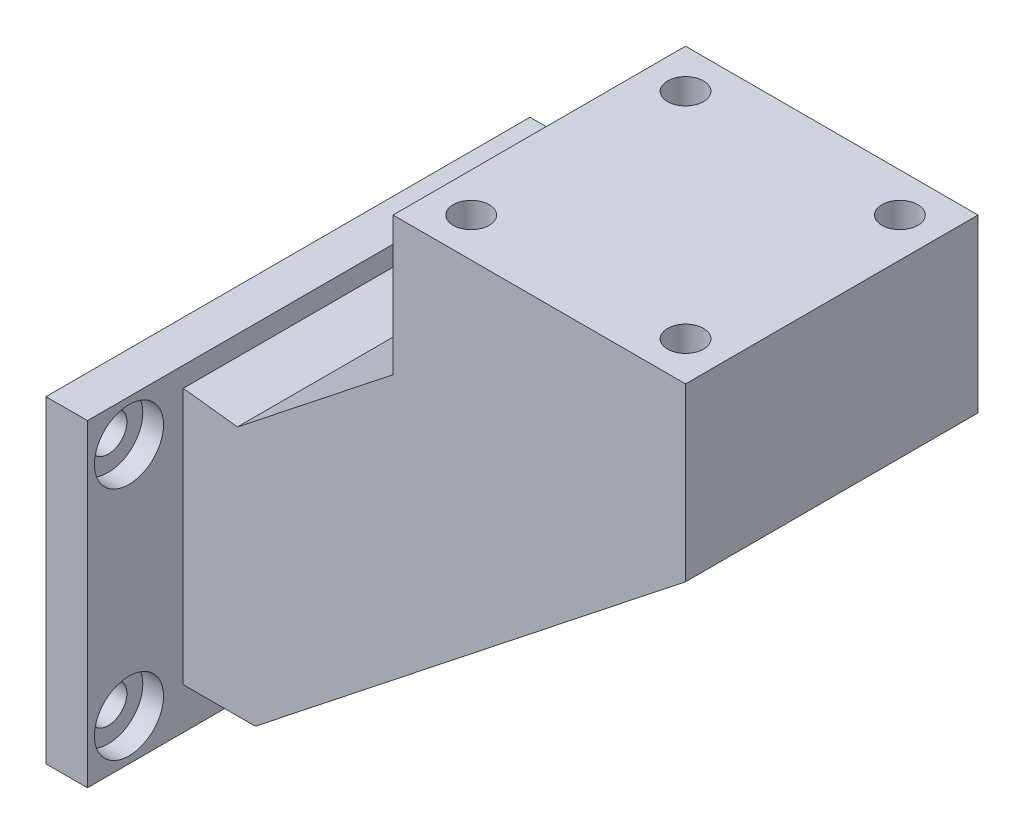
ISO-10303-21;
HEADER;
FILE_DESCRIPTION(('STEP AP214'),'2;1');
FILE_NAME('part.step','',(''),(''),'','','');
FILE_SCHEMA(('AUTOMOTIVE_DESIGN { 1 0 10303 214 1 1 1 1 }'));
ENDSEC;
DATA;
#1=APPLICATION_CONTEXT('core data for automotive mechanical design processes');
#2=APPLICATION_PROTOCOL_DEFINITION('international standard','automotive_design',2000,#1);
#3=PRODUCT_CONTEXT('',#1,'mechanical');
#4=PRODUCT('Part','Part','',(#3));
#5=PRODUCT_RELATED_PRODUCT_CATEGORY('part','',(#4));
#6=PRODUCT_DEFINITION_FORMATION('','',#4);
#7=PRODUCT_DEFINITION_CONTEXT('part definition',#1,'design');
#8=PRODUCT_DEFINITION('design','',#6,#7);
#9=PRODUCT_DEFINITION_SHAPE('','',#8);
#10=(LENGTH_UNIT() NAMED_UNIT(*) SI_UNIT(.MILLI.,.METRE.));
#11=(NAMED_UNIT(*) PLANE_ANGLE_UNIT() SI_UNIT($,.RADIAN.));
#12=(NAMED_UNIT(*) SI_UNIT($,.STERADIAN.) SOLID_ANGLE_UNIT());
#13=UNCERTAINTY_MEASURE_WITH_UNIT(LENGTH_MEASURE(1.E-05),#10,'distance_accuracy_value','');
#14=(GEOMETRIC_REPRESENTATION_CONTEXT(3) GLOBAL_UNCERTAINTY_ASSIGNED_CONTEXT((#13)) GLOBAL_UNIT_ASSIGNED_CONTEXT((#10,
#11,#12)) REPRESENTATION_CONTEXT('',''));
#15=CARTESIAN_POINT('',(0.,0.,0.));
#16=DIRECTION('',(0.,0.,1.));
#17=DIRECTION('',(1.,0.,0.));
#18=AXIS2_PLACEMENT_3D('',#15,#16,#17);
#19=CARTESIAN_POINT('',(16.4283340799578,6.,70.));
#20=DIRECTION('',(0.,1.,0.));
#21=DIRECTION('',(-1.,0.,0.));
#22=AXIS2_PLACEMENT_3D('',#19,#20,#21);
#23=PLANE('',#22);
#24=DIRECTION('',(0.,0.,-1.));
#25=VECTOR('',#24,1.);
#26=CARTESIAN_POINT('',(6.00000000000003,6.,70.));
#27=LINE('',#26,#25);
#28=CARTESIAN_POINT('',(6.00000000000003,6.,56.15));
#29=VERTEX_POINT('',#28);
#30=CARTESIAN_POINT('',(6.00000000000003,6.,13.85));
#31=VERTEX_POINT('',#30);
#32=EDGE_CURVE('E282',#29,#31,#27,.T.);
#33=ORIENTED_EDGE('',*,*,#32,.T.);
#34=DIRECTION('',(-1.,0.,0.));
#35=VECTOR('',#34,1.);
#36=CARTESIAN_POINT('',(16.4283340799578,6.,13.85));
#37=LINE('',#36,#35);
#38=CARTESIAN_POINT('',(16.4283340799578,6.,13.85));
#39=VERTEX_POINT('',#38);
#40=EDGE_CURVE('E222',#39,#31,#37,.T.);
#41=ORIENTED_EDGE('',*,*,#40,.F.);
#42=DIRECTION('',(0.,0.,-1.));
#43=VECTOR('',#42,1.);
#44=CARTESIAN_POINT('',(16.4283340799578,6.,70.));
#45=LINE('',#44,#43);
#46=CARTESIAN_POINT('',(16.4283340799578,5.99999999999999,56.15));
#47=VERTEX_POINT('',#46);
#48=EDGE_CURVE('E279',#47,#39,#45,.T.);
#49=ORIENTED_EDGE('',*,*,#48,.F.);
#50=DIRECTION('',(1.,0.,0.));
#51=VECTOR('',#50,1.);
#52=CARTESIAN_POINT('',(0.,6.,56.15));
#53=LINE('',#52,#51);
#54=EDGE_CURVE('E228',#29,#47,#53,.T.);
#55=ORIENTED_EDGE('',*,*,#54,.F.);
#56=EDGE_LOOP('',(#33,#41,#49,#55));
#57=FACE_BOUND('',#56,.T.);
#58=ADVANCED_FACE('F39',(#57),#23,.F.);
#59=CARTESIAN_POINT('',(78.65,55.2032943025046,70.));
#60=DIRECTION('',(-0.620272565762113,0.784386348786671,0.));
#61=DIRECTION('',(-0.784386348786671,-0.620272565762113,0.));
#62=AXIS2_PLACEMENT_3D('',#59,#60,#61);
#63=PLANE('',#62);
#64=ORIENTED_EDGE('',*,*,#48,.T.);
#65=DIRECTION('',(-0.784386348786671,-0.620272565762113,0.));
#66=VECTOR('',#65,1.);
#67=CARTESIAN_POINT('',(78.65,55.2032943025046,13.85));
#68=LINE('',#67,#66);
#69=CARTESIAN_POINT('',(78.65,55.2032943025046,13.85));
#70=VERTEX_POINT('',#69);
#71=EDGE_CURVE('E220',#70,#39,#68,.T.);
#72=ORIENTED_EDGE('',*,*,#71,.F.);
#73=DIRECTION('',(0.,0.,-1.));
#74=VECTOR('',#73,1.);
#75=CARTESIAN_POINT('',(78.65,55.2032943025046,70.));
#76=LINE('',#75,#74);
#77=CARTESIAN_POINT('',(78.65,55.2032943025046,56.15));
#78=VERTEX_POINT('',#77);
#79=EDGE_CURVE('E276',#78,#70,#76,.T.);
#80=ORIENTED_EDGE('',*,*,#79,.F.);
#81=DIRECTION('',(0.784386348786671,0.620272565762113,0.));
#82=VECTOR('',#81,1.);
#83=CARTESIAN_POINT('',(3.40140531590146,-4.30136047240039,56.15));
#84=LINE('',#83,#82);
#85=EDGE_CURVE('E230',#47,#78,#84,.T.);
#86=ORIENTED_EDGE('',*,*,#85,.F.);
#87=EDGE_LOOP('',(#64,#72,#80,#86));
#88=FACE_BOUND('',#87,.T.);
#89=ADVANCED_FACE('F330',(#88),#63,.F.);
#90=CARTESIAN_POINT('',(78.65,80.,70.));
#91=DIRECTION('',(-1.,0.,0.));
#92=DIRECTION('',(0.,-1.,0.));
#93=AXIS2_PLACEMENT_3D('',#90,#91,#92);
#94=PLANE('',#93);
#95=ORIENTED_EDGE('',*,*,#79,.T.);
#96=DIRECTION('',(0.,-1.,0.));
#97=VECTOR('',#96,1.);
#98=CARTESIAN_POINT('',(78.65,80.,13.85));
#99=LINE('',#98,#97);
#100=CARTESIAN_POINT('',(78.65,80.,13.85));
#101=VERTEX_POINT('',#100);
#102=EDGE_CURVE('E218',#101,#70,#99,.T.);
#103=ORIENTED_EDGE('',*,*,#102,.F.);
#104=DIRECTION('',(0.,0.,-1.));
#105=VECTOR('',#104,1.);
#106=CARTESIAN_POINT('',(78.65,80.,70.));
#107=LINE('',#106,#105);
#108=CARTESIAN_POINT('',(78.65,80.,56.15));
#109=VERTEX_POINT('',#108);
#110=EDGE_CURVE('E273',#109,#101,#107,.T.);
#111=ORIENTED_EDGE('',*,*,#110,.F.);
#112=DIRECTION('',(0.,1.,0.));
#113=VECTOR('',#112,1.);
#114=CARTESIAN_POINT('',(78.65,0.,56.15));
#115=LINE('',#114,#113);
#116=EDGE_CURVE('E232',#78,#109,#115,.T.);
#117=ORIENTED_EDGE('',*,*,#116,.F.);
#118=EDGE_LOOP('',(#95,#103,#111,#117));
#119=FACE_BOUND('',#118,.T.);
#120=ADVANCED_FACE('F325',(#119),#94,.F.);
#121=CARTESIAN_POINT('',(36.35,80.,70.));
#122=DIRECTION('',(0.,-1.,0.));
#123=DIRECTION('',(0.,0.,-1.));
#124=AXIS2_PLACEMENT_3D('',#121,#122,#123);
#125=PLANE('',#124);
#126=CARTESIAN_POINT('',(42.,80.,19.5));
#127=DIRECTION('',(0.,1.,0.));
#128=DIRECTION('',(0.,0.,1.));
#129=AXIS2_PLACEMENT_3D('',#126,#127,#128);
#130=CIRCLE('',#129,2.6);
#131=CARTESIAN_POINT('',(42.,80.,22.1));
#132=VERTEX_POINT('',#131);
#133=EDGE_CURVE('E150',#132,#132,#130,.T.);
#134=ORIENTED_EDGE('',*,*,#133,.F.);
#135=EDGE_LOOP('',(#134));
#136=FACE_BOUND('',#135,.T.);
#137=CARTESIAN_POINT('',(73.,80.,50.5));
#138=DIRECTION('',(0.,1.,0.));
#139=DIRECTION('',(0.,0.,1.));
#140=AXIS2_PLACEMENT_3D('',#137,#138,#139);
#141=CIRCLE('',#140,2.59999999999999);
#142=CARTESIAN_POINT('',(73.,80.,53.1));
#143=VERTEX_POINT('',#142);
#144=EDGE_CURVE('E149',#143,#143,#141,.T.);
#145=ORIENTED_EDGE('',*,*,#144,.F.);
#146=EDGE_LOOP('',(#145));
#147=FACE_BOUND('',#146,.T.);
#148=CARTESIAN_POINT('',(42.,80.,50.5));
#149=DIRECTION('',(0.,1.,0.));
#150=DIRECTION('',(0.,0.,1.));
#151=AXIS2_PLACEMENT_3D('',#148,#149,#150);
#152=CIRCLE('',#151,2.6);
#153=CARTESIAN_POINT('',(42.,80.,53.1));
#154=VERTEX_POINT('',#153);
#155=EDGE_CURVE('E160',#154,#154,#152,.T.);
#156=ORIENTED_EDGE('',*,*,#155,.F.);
#157=EDGE_LOOP('',(#156));
#158=FACE_BOUND('',#157,.T.);
#159=CARTESIAN_POINT('',(73.,80.,19.5));
#160=DIRECTION('',(0.,1.,0.));
#161=DIRECTION('',(0.,0.,1.));
#162=AXIS2_PLACEMENT_3D('',#159,#160,#161);
#163=CIRCLE('',#162,2.59999999999999);
#164=CARTESIAN_POINT('',(73.,80.,22.1));
#165=VERTEX_POINT('',#164);
#166=EDGE_CURVE('E166',#165,#165,#163,.T.);
#167=ORIENTED_EDGE('',*,*,#166,.F.);
#168=EDGE_LOOP('',(#167));
#169=FACE_BOUND('',#168,.T.);
#170=ORIENTED_EDGE('',*,*,#110,.T.);
#171=DIRECTION('',(1.,0.,0.));
#172=VECTOR('',#171,1.);
#173=CARTESIAN_POINT('',(36.35,80.,13.85));
#174=LINE('',#173,#172);
#175=CARTESIAN_POINT('',(36.35,80.,13.85));
#176=VERTEX_POINT('',#175);
#177=EDGE_CURVE('E216',#176,#101,#174,.T.);
#178=ORIENTED_EDGE('',*,*,#177,.F.);
#179=DIRECTION('',(0.,0.,-1.));
#180=VECTOR('',#179,1.);
#181=CARTESIAN_POINT('',(36.35,80.,70.));
#182=LINE('',#181,#180);
#183=CARTESIAN_POINT('',(36.35,80.,56.15));
#184=VERTEX_POINT('',#183);
#185=EDGE_CURVE('E270',#184,#176,#182,.T.);
#186=ORIENTED_EDGE('',*,*,#185,.F.);
#187=DIRECTION('',(-1.,0.,0.));
#188=VECTOR('',#187,1.);
#189=CARTESIAN_POINT('',(0.,80.,56.15));
#190=LINE('',#189,#188);
#191=EDGE_CURVE('E234',#109,#184,#190,.T.);
#192=ORIENTED_EDGE('',*,*,#191,.F.);
#193=EDGE_LOOP('',(#170,#178,#186,#192));
#194=FACE_BOUND('',#193,.T.);
#195=ADVANCED_FACE('F320',(#136,#147,#158,#169,#194),#125,.F.);
#196=CARTESIAN_POINT('',(36.35,60.,70.));
#197=DIRECTION('',(1.,0.,0.));
#198=DIRECTION('',(0.,0.,-1.));
#199=AXIS2_PLACEMENT_3D('',#196,#197,#198);
#200=PLANE('',#199);
#201=ORIENTED_EDGE('',*,*,#185,.T.);
#202=DIRECTION('',(0.,1.,0.));
#203=VECTOR('',#202,1.);
#204=CARTESIAN_POINT('',(36.35,60.,13.85));
#205=LINE('',#204,#203);
#206=CARTESIAN_POINT('',(36.35,60.,13.85));
#207=VERTEX_POINT('',#206);
#208=EDGE_CURVE('E214',#207,#176,#205,.T.);
#209=ORIENTED_EDGE('',*,*,#208,.F.);
#210=DIRECTION('',(0.,0.,-1.));
#211=VECTOR('',#210,1.);
#212=CARTESIAN_POINT('',(36.35,60.,70.));
#213=LINE('',#212,#211);
#214=CARTESIAN_POINT('',(36.35,60.,56.15));
#215=VERTEX_POINT('',#214);
#216=EDGE_CURVE('E267',#215,#207,#213,.T.);
#217=ORIENTED_EDGE('',*,*,#216,.F.);
#218=DIRECTION('',(0.,-1.,0.));
#219=VECTOR('',#218,1.);
#220=CARTESIAN_POINT('',(36.35,0.,56.15));
#221=LINE('',#220,#219);
#222=EDGE_CURVE('E236',#184,#215,#221,.T.);
#223=ORIENTED_EDGE('',*,*,#222,.F.);
#224=EDGE_LOOP('',(#201,#209,#217,#223));
#225=FACE_BOUND('',#224,.T.);
#226=ADVANCED_FACE('F314',(#225),#200,.F.);
#227=CARTESIAN_POINT('',(6.00000000000002,36.,70.));
#228=DIRECTION('',(0.620272565762113,-0.784386348786671,0.));
#229=DIRECTION('',(0.784386348786671,0.620272565762113,0.));
#230=AXIS2_PLACEMENT_3D('',#227,#228,#229);
#231=PLANE('',#230);
#232=DIRECTION('',(0.784386348786671,0.620272565762113,0.));
#233=VECTOR('',#232,1.);
#234=CARTESIAN_POINT('',(6.00000000000002,36.,13.85));
#235=LINE('',#234,#233);
#236=CARTESIAN_POINT('',(13.8438634878667,42.2027256576211,13.85));
#237=VERTEX_POINT('',#236);
#238=EDGE_CURVE('E212',#237,#207,#235,.T.);
#239=ORIENTED_EDGE('',*,*,#238,.F.);
#240=DIRECTION('',(0.,0.,1.));
#241=VECTOR('',#240,1.);
#242=CARTESIAN_POINT('',(13.8438634878667,42.2027256576211,56.15));
#243=LINE('',#242,#241);
#244=CARTESIAN_POINT('',(13.8438634878667,42.2027256576211,56.15));
#245=VERTEX_POINT('',#244);
#246=EDGE_CURVE('E55',#237,#245,#243,.T.);
#247=ORIENTED_EDGE('',*,*,#246,.T.);
#248=DIRECTION('',(-0.784386348786671,-0.620272565762113,0.));
#249=VECTOR('',#248,1.);
#250=CARTESIAN_POINT('',(-15.2067716569619,19.2302299911998,56.15));
#251=LINE('',#250,#249);
#252=EDGE_CURVE('E238',#215,#245,#251,.T.);
#253=ORIENTED_EDGE('',*,*,#252,.F.);
#254=ORIENTED_EDGE('',*,*,#216,.T.);
#255=EDGE_LOOP('',(#239,#247,#253,#254));
#256=FACE_BOUND('',#255,.T.);
#257=ADVANCED_FACE('F311',(#256),#231,.F.);
#258=CARTESIAN_POINT('',(6.00000000000003,0.,70.));
#259=DIRECTION('',(0.,1.,0.));
#260=DIRECTION('',(-1.,0.,0.));
#261=AXIS2_PLACEMENT_3D('',#258,#259,#260);
#262=PLANE('',#261);
#263=DIRECTION('',(1.,0.,0.));
#264=VECTOR('',#263,1.);
#265=CARTESIAN_POINT('',(6.00000000000003,0.,0.));
#266=LINE('',#265,#264);
#267=CARTESIAN_POINT('',(0.,0.,0.));
#268=VERTEX_POINT('',#267);
#269=CARTESIAN_POINT('',(6.00000000000003,0.,0.));
#270=VERTEX_POINT('',#269);
#271=EDGE_CURVE('E240',#268,#270,#266,.T.);
#272=ORIENTED_EDGE('',*,*,#271,.T.);
#273=DIRECTION('',(0.,0.,-1.));
#274=VECTOR('',#273,1.);
#275=CARTESIAN_POINT('',(6.00000000000003,0.,70.));
#276=LINE('',#275,#274);
#277=CARTESIAN_POINT('',(6.00000000000003,0.,70.));
#278=VERTEX_POINT('',#277);
#279=EDGE_CURVE('E285',#278,#270,#276,.T.);
#280=ORIENTED_EDGE('',*,*,#279,.F.);
#281=DIRECTION('',(1.,0.,0.));
#282=VECTOR('',#281,1.);
#283=CARTESIAN_POINT('',(6.00000000000003,0.,70.));
#284=LINE('',#283,#282);
#285=CARTESIAN_POINT('',(0.,0.,70.));
#286=VERTEX_POINT('',#285);
#287=EDGE_CURVE('E241',#286,#278,#284,.T.);
#288=ORIENTED_EDGE('',*,*,#287,.F.);
#289=DIRECTION('',(0.,0.,-1.));
#290=VECTOR('',#289,1.);
#291=CARTESIAN_POINT('',(0.,0.,70.));
#292=LINE('',#291,#290);
#293=EDGE_CURVE('E251',#286,#268,#292,.T.);
#294=ORIENTED_EDGE('',*,*,#293,.T.);
#295=EDGE_LOOP('',(#272,#280,#288,#294));
#296=FACE_BOUND('',#295,.T.);
#297=ADVANCED_FACE('F341',(#296),#262,.F.);
#298=CARTESIAN_POINT('',(6.,46.,70.));
#299=DIRECTION('',(-1.,0.,0.));
#300=DIRECTION('',(0.,-1.,0.));
#301=AXIS2_PLACEMENT_3D('',#298,#299,#300);
#302=PLANE('',#301);
#303=CARTESIAN_POINT('',(6.00000000000011,6.00000000000001,64.));
#304=DIRECTION('',(1.,0.,0.));
#305=DIRECTION('',(0.,0.,-1.));
#306=AXIS2_PLACEMENT_3D('',#303,#304,#305);
#307=CIRCLE('',#306,4.99999999999999);
#308=CARTESIAN_POINT('',(6.00000000000011,6.00000000000001,59.));
#309=VERTEX_POINT('',#308);
#310=EDGE_CURVE('E172',#309,#309,#307,.T.);
#311=ORIENTED_EDGE('',*,*,#310,.F.);
#312=EDGE_LOOP('',(#311));
#313=FACE_BOUND('',#312,.T.);
#314=CARTESIAN_POINT('',(6.00000000000011,6.00000000000001,6.));
#315=DIRECTION('',(1.,0.,0.));
#316=DIRECTION('',(0.,0.,-1.));
#317=AXIS2_PLACEMENT_3D('',#314,#315,#316);
#318=CIRCLE('',#317,4.99999999999999);
#319=CARTESIAN_POINT('',(6.00000000000011,6.00000000000001,1.));
#320=VERTEX_POINT('',#319);
#321=EDGE_CURVE('E182',#320,#320,#318,.T.);
#322=ORIENTED_EDGE('',*,*,#321,.F.);
#323=EDGE_LOOP('',(#322));
#324=FACE_BOUND('',#323,.T.);
#325=CARTESIAN_POINT('',(6.00000000000009,40.,6.));
#326=DIRECTION('',(1.,0.,0.));
#327=DIRECTION('',(0.,0.,-1.));
#328=AXIS2_PLACEMENT_3D('',#325,#326,#327);
#329=CIRCLE('',#328,4.99999999999999);
#330=CARTESIAN_POINT('',(6.00000000000009,40.,1.00000000000001));
#331=VERTEX_POINT('',#330);
#332=EDGE_CURVE('E192',#331,#331,#329,.T.);
#333=ORIENTED_EDGE('',*,*,#332,.F.);
#334=EDGE_LOOP('',(#333));
#335=FACE_BOUND('',#334,.T.);
#336=CARTESIAN_POINT('',(6.00000000000009,40.,64.));
#337=DIRECTION('',(1.,0.,0.));
#338=DIRECTION('',(0.,0.,-1.));
#339=AXIS2_PLACEMENT_3D('',#336,#337,#338);
#340=CIRCLE('',#339,4.99999999999999);
#341=CARTESIAN_POINT('',(6.00000000000009,40.,59.));
#342=VERTEX_POINT('',#341);
#343=EDGE_CURVE('E202',#342,#342,#340,.T.);
#344=ORIENTED_EDGE('',*,*,#343,.F.);
#345=EDGE_LOOP('',(#344));
#346=FACE_BOUND('',#345,.T.);
#347=ORIENTED_EDGE('',*,*,#279,.T.);
#348=DIRECTION('',(0.,1.,0.));
#349=VECTOR('',#348,1.);
#350=CARTESIAN_POINT('',(6.,46.,0.));
#351=LINE('',#350,#349);
#352=CARTESIAN_POINT('',(6.,46.,0.));
#353=VERTEX_POINT('',#352);
#354=EDGE_CURVE('E254',#270,#353,#351,.T.);
#355=ORIENTED_EDGE('',*,*,#354,.T.);
#356=DIRECTION('',(0.,0.,-1.));
#357=VECTOR('',#356,1.);
#358=CARTESIAN_POINT('',(6.,46.,70.));
#359=LINE('',#358,#357);
#360=CARTESIAN_POINT('',(6.,46.,70.));
#361=VERTEX_POINT('',#360);
#362=EDGE_CURVE('E264',#361,#353,#359,.T.);
#363=ORIENTED_EDGE('',*,*,#362,.F.);
#364=DIRECTION('',(0.,1.,0.));
#365=VECTOR('',#364,1.);
#366=CARTESIAN_POINT('',(6.00000000000003,6.,70.));
#367=LINE('',#366,#365);
#368=EDGE_CURVE('E244',#278,#361,#367,.T.);
#369=ORIENTED_EDGE('',*,*,#368,.F.);
#370=EDGE_LOOP('',(#347,#355,#363,#369));
#371=FACE_BOUND('',#370,.T.);
#372=DIRECTION('',(0.,0.,-1.));
#373=VECTOR('',#372,1.);
#374=CARTESIAN_POINT('',(6.00000000000001,43.1191660099294,13.85));
#375=LINE('',#374,#373);
#376=CARTESIAN_POINT('',(6.00000000000002,43.1191660099294,56.15));
#377=VERTEX_POINT('',#376);
#378=CARTESIAN_POINT('',(6.00000000000001,43.1191660099294,13.85));
#379=VERTEX_POINT('',#378);
#380=EDGE_CURVE('E288',#377,#379,#375,.T.);
#381=ORIENTED_EDGE('',*,*,#380,.T.);
#382=DIRECTION('',(0.,1.,0.));
#383=VECTOR('',#382,1.);
#384=CARTESIAN_POINT('',(6.00000000000003,6.,13.85));
#385=LINE('',#384,#383);
#386=EDGE_CURVE('E224',#31,#379,#385,.T.);
#387=ORIENTED_EDGE('',*,*,#386,.F.);
#388=ORIENTED_EDGE('',*,*,#32,.F.);
#389=DIRECTION('',(0.,1.,0.));
#390=VECTOR('',#389,1.);
#391=CARTESIAN_POINT('',(6.00000000000003,0.,56.15));
#392=LINE('',#391,#390);
#393=EDGE_CURVE('E226',#29,#377,#392,.T.);
#394=ORIENTED_EDGE('',*,*,#393,.T.);
#395=EDGE_LOOP('',(#381,#387,#388,#394));
#396=FACE_BOUND('',#395,.T.);
#397=ADVANCED_FACE('F302',(#313,#324,#335,#346,#371,#396),#302,.F.);
#398=CARTESIAN_POINT('',(0.,46.,70.));
#399=DIRECTION('',(0.,-1.,0.));
#400=DIRECTION('',(0.,0.,-1.));
#401=AXIS2_PLACEMENT_3D('',#398,#399,#400);
#402=PLANE('',#401);
#403=DIRECTION('',(-1.,0.,0.));
#404=VECTOR('',#403,1.);
#405=CARTESIAN_POINT('',(0.,46.,0.));
#406=LINE('',#405,#404);
#407=CARTESIAN_POINT('',(0.,46.,0.));
#408=VERTEX_POINT('',#407);
#409=EDGE_CURVE('E256',#353,#408,#406,.T.);
#410=ORIENTED_EDGE('',*,*,#409,.T.);
#411=DIRECTION('',(0.,0.,-1.));
#412=VECTOR('',#411,1.);
#413=CARTESIAN_POINT('',(0.,46.,70.));
#414=LINE('',#413,#412);
#415=CARTESIAN_POINT('',(0.,46.,70.));
#416=VERTEX_POINT('',#415);
#417=EDGE_CURVE('E261',#416,#408,#414,.T.);
#418=ORIENTED_EDGE('',*,*,#417,.F.);
#419=DIRECTION('',(-1.,0.,0.));
#420=VECTOR('',#419,1.);
#421=CARTESIAN_POINT('',(0.,46.,70.));
#422=LINE('',#421,#420);
#423=EDGE_CURVE('E247',#361,#416,#422,.T.);
#424=ORIENTED_EDGE('',*,*,#423,.F.);
#425=ORIENTED_EDGE('',*,*,#362,.T.);
#426=EDGE_LOOP('',(#410,#418,#424,#425));
#427=FACE_BOUND('',#426,.T.);
#428=ADVANCED_FACE('F348',(#427),#402,.F.);
#429=CARTESIAN_POINT('',(0.,0.,70.));
#430=DIRECTION('',(1.,0.,0.));
#431=DIRECTION('',(0.,0.,-1.));
#432=AXIS2_PLACEMENT_3D('',#429,#430,#431);
#433=PLANE('',#432);
#434=CARTESIAN_POINT('',(0.,6.00000000000001,64.));
#435=DIRECTION('',(1.,0.,0.));
#436=DIRECTION('',(0.,0.,-1.));
#437=AXIS2_PLACEMENT_3D('',#434,#435,#436);
#438=CIRCLE('',#437,2.69999999999999);
#439=CARTESIAN_POINT('',(0.,6.00000000000001,61.3));
#440=VERTEX_POINT('',#439);
#441=EDGE_CURVE('E181',#440,#440,#438,.T.);
#442=ORIENTED_EDGE('',*,*,#441,.T.);
#443=EDGE_LOOP('',(#442));
#444=FACE_BOUND('',#443,.T.);
#445=CARTESIAN_POINT('',(0.,6.00000000000001,6.));
#446=DIRECTION('',(1.,0.,0.));
#447=DIRECTION('',(0.,0.,-1.));
#448=AXIS2_PLACEMENT_3D('',#445,#446,#447);
#449=CIRCLE('',#448,2.69999999999999);
#450=CARTESIAN_POINT('',(0.,6.00000000000001,3.3));
#451=VERTEX_POINT('',#450);
#452=EDGE_CURVE('E191',#451,#451,#449,.T.);
#453=ORIENTED_EDGE('',*,*,#452,.T.);
#454=EDGE_LOOP('',(#453));
#455=FACE_BOUND('',#454,.T.);
#456=CARTESIAN_POINT('',(0.,40.,6.));
#457=DIRECTION('',(1.,0.,0.));
#458=DIRECTION('',(0.,0.,-1.));
#459=AXIS2_PLACEMENT_3D('',#456,#457,#458);
#460=CIRCLE('',#459,2.69999999999999);
#461=CARTESIAN_POINT('',(0.,40.,3.3));
#462=VERTEX_POINT('',#461);
#463=EDGE_CURVE('E201',#462,#462,#460,.T.);
#464=ORIENTED_EDGE('',*,*,#463,.T.);
#465=EDGE_LOOP('',(#464));
#466=FACE_BOUND('',#465,.T.);
#467=CARTESIAN_POINT('',(0.,40.,64.));
#468=DIRECTION('',(1.,0.,0.));
#469=DIRECTION('',(0.,0.,-1.));
#470=AXIS2_PLACEMENT_3D('',#467,#468,#469);
#471=CIRCLE('',#470,2.69999999999999);
#472=CARTESIAN_POINT('',(0.,40.,61.3));
#473=VERTEX_POINT('',#472);
#474=EDGE_CURVE('E211',#473,#473,#471,.T.);
#475=ORIENTED_EDGE('',*,*,#474,.T.);
#476=EDGE_LOOP('',(#475));
#477=FACE_BOUND('',#476,.T.);
#478=DIRECTION('',(0.,-1.,0.));
#479=VECTOR('',#478,1.);
#480=CARTESIAN_POINT('',(0.,0.,0.));
#481=LINE('',#480,#479);
#482=EDGE_CURVE('E245',#408,#268,#481,.T.);
#483=ORIENTED_EDGE('',*,*,#482,.T.);
#484=ORIENTED_EDGE('',*,*,#293,.F.);
#485=DIRECTION('',(0.,-1.,0.));
#486=VECTOR('',#485,1.);
#487=CARTESIAN_POINT('',(0.,0.,70.));
#488=LINE('',#487,#486);
#489=EDGE_CURVE('E249',#416,#286,#488,.T.);
#490=ORIENTED_EDGE('',*,*,#489,.F.);
#491=ORIENTED_EDGE('',*,*,#417,.T.);
#492=EDGE_LOOP('',(#483,#484,#490,#491));
#493=FACE_BOUND('',#492,.T.);
#494=ADVANCED_FACE('F368',(#444,#455,#466,#477,#493),#433,.F.);
#495=CARTESIAN_POINT('',(0.,0.,70.));
#496=DIRECTION('',(0.,0.,-1.));
#497=DIRECTION('',(-1.,0.,0.));
#498=AXIS2_PLACEMENT_3D('',#495,#496,#497);
#499=PLANE('',#498);
#500=ORIENTED_EDGE('',*,*,#368,.T.);
#501=ORIENTED_EDGE('',*,*,#423,.T.);
#502=ORIENTED_EDGE('',*,*,#489,.T.);
#503=ORIENTED_EDGE('',*,*,#287,.T.);
#504=EDGE_LOOP('',(#500,#501,#502,#503));
#505=FACE_BOUND('',#504,.T.);
#506=ADVANCED_FACE('F364',(#505),#499,.F.);
#507=CARTESIAN_POINT('',(0.,0.,0.));
#508=DIRECTION('',(0.,0.,-1.));
#509=DIRECTION('',(-1.,0.,0.));
#510=AXIS2_PLACEMENT_3D('',#507,#508,#509);
#511=PLANE('',#510);
#512=ORIENTED_EDGE('',*,*,#354,.F.);
#513=ORIENTED_EDGE('',*,*,#271,.F.);
#514=ORIENTED_EDGE('',*,*,#482,.F.);
#515=ORIENTED_EDGE('',*,*,#409,.F.);
#516=EDGE_LOOP('',(#512,#513,#514,#515));
#517=FACE_BOUND('',#516,.T.);
#518=ADVANCED_FACE('F358',(#517),#511,.T.);
#519=CARTESIAN_POINT('',(0.,0.,56.15));
#520=DIRECTION('',(0.,0.,1.));
#521=DIRECTION('',(1.,0.,0.));
#522=AXIS2_PLACEMENT_3D('',#519,#520,#521);
#523=PLANE('',#522);
#524=ORIENTED_EDGE('',*,*,#393,.F.);
#525=ORIENTED_EDGE('',*,*,#54,.T.);
#526=ORIENTED_EDGE('',*,*,#85,.T.);
#527=ORIENTED_EDGE('',*,*,#116,.T.);
#528=ORIENTED_EDGE('',*,*,#191,.T.);
#529=ORIENTED_EDGE('',*,*,#222,.T.);
#530=ORIENTED_EDGE('',*,*,#252,.T.);
#531=DIRECTION('',(0.99324384373158,-0.116045968862847,0.));
#532=VECTOR('',#531,1.);
#533=CARTESIAN_POINT('',(6.00000000000001,43.1191660099294,56.15));
#534=LINE('',#533,#532);
#535=EDGE_CURVE('E11',#245,#377,#534,.F.);
#536=ORIENTED_EDGE('',*,*,#535,.T.);
#537=EDGE_LOOP('',(#524,#525,#526,#527,#528,#529,#530,#536));
#538=FACE_BOUND('',#537,.T.);
#539=ADVANCED_FACE('F307',(#538),#523,.T.);
#540=CARTESIAN_POINT('',(0.,0.,13.85));
#541=DIRECTION('',(0.,0.,1.));
#542=DIRECTION('',(1.,0.,0.));
#543=AXIS2_PLACEMENT_3D('',#540,#541,#542);
#544=PLANE('',#543);
#545=ORIENTED_EDGE('',*,*,#386,.T.);
#546=DIRECTION('',(-0.99324384373158,0.116045968862847,0.));
#547=VECTOR('',#546,1.);
#548=CARTESIAN_POINT('',(5.05079890632275,43.2300662297059,13.85));
#549=LINE('',#548,#547);
#550=EDGE_CURVE('E48',#379,#237,#549,.F.);
#551=ORIENTED_EDGE('',*,*,#550,.T.);
#552=ORIENTED_EDGE('',*,*,#238,.T.);
#553=ORIENTED_EDGE('',*,*,#208,.T.);
#554=ORIENTED_EDGE('',*,*,#177,.T.);
#555=ORIENTED_EDGE('',*,*,#102,.T.);
#556=ORIENTED_EDGE('',*,*,#71,.T.);
#557=ORIENTED_EDGE('',*,*,#40,.T.);
#558=EDGE_LOOP('',(#545,#551,#552,#553,#554,#555,#556,#557));
#559=FACE_BOUND('',#558,.T.);
#560=ADVANCED_FACE('F317',(#559),#544,.F.);
#561=CARTESIAN_POINT('',(6.00000000000009,40.,64.));
#562=DIRECTION('',(1.,0.,0.));
#563=DIRECTION('',(0.,0.,-1.));
#564=AXIS2_PLACEMENT_3D('',#561,#562,#563);
#565=CYLINDRICAL_SURFACE('',#564,2.69999999999999);
#566=CARTESIAN_POINT('',(3.00000000000009,40.,64.));
#567=DIRECTION('',(1.,0.,0.));
#568=DIRECTION('',(0.,0.,-1.));
#569=AXIS2_PLACEMENT_3D('',#566,#567,#568);
#570=CIRCLE('',#569,2.69999999999999);
#571=CARTESIAN_POINT('',(3.00000000000009,40.,61.3));
#572=VERTEX_POINT('',#571);
#573=EDGE_CURVE('E208',#572,#572,#570,.T.);
#574=ORIENTED_EDGE('',*,*,#573,.T.);
#575=EDGE_LOOP('',(#574));
#576=FACE_BOUND('',#575,.T.);
#577=ORIENTED_EDGE('',*,*,#474,.F.);
#578=EDGE_LOOP('',(#577));
#579=FACE_BOUND('',#578,.T.);
#580=ADVANCED_FACE('F435',(#576,#579),#565,.F.);
#581=CARTESIAN_POINT('',(3.00000000000009,42.7,64.));
#582=DIRECTION('',(-1.,0.,0.));
#583=DIRECTION('',(0.,0.,1.));
#584=AXIS2_PLACEMENT_3D('',#581,#582,#583);
#585=PLANE('',#584);
#586=ORIENTED_EDGE('',*,*,#573,.F.);
#587=EDGE_LOOP('',(#586));
#588=FACE_BOUND('',#587,.T.);
#589=CARTESIAN_POINT('',(3.00000000000009,40.,64.));
#590=DIRECTION('',(1.,0.,0.));
#591=DIRECTION('',(0.,0.,-1.));
#592=AXIS2_PLACEMENT_3D('',#589,#590,#591);
#593=CIRCLE('',#592,5.);
#594=CARTESIAN_POINT('',(3.00000000000009,40.,59.));
#595=VERTEX_POINT('',#594);
#596=EDGE_CURVE('E205',#595,#595,#593,.T.);
#597=ORIENTED_EDGE('',*,*,#596,.T.);
#598=EDGE_LOOP('',(#597));
#599=FACE_BOUND('',#598,.T.);
#600=ADVANCED_FACE('F631',(#588,#599),#585,.F.);
#601=CARTESIAN_POINT('',(6.00000000000009,40.,64.));
#602=DIRECTION('',(1.,0.,0.));
#603=DIRECTION('',(0.,0.,-1.));
#604=AXIS2_PLACEMENT_3D('',#601,#602,#603);
#605=CYLINDRICAL_SURFACE('',#604,4.99999999999999);
#606=ORIENTED_EDGE('',*,*,#596,.F.);
#607=EDGE_LOOP('',(#606));
#608=FACE_BOUND('',#607,.T.);
#609=ORIENTED_EDGE('',*,*,#343,.T.);
#610=EDGE_LOOP('',(#609));
#611=FACE_BOUND('',#610,.T.);
#612=ADVANCED_FACE('F621',(#608,#611),#605,.F.);
#613=CARTESIAN_POINT('',(6.00000000000009,40.,6.));
#614=DIRECTION('',(1.,0.,0.));
#615=DIRECTION('',(0.,0.,-1.));
#616=AXIS2_PLACEMENT_3D('',#613,#614,#615);
#617=CYLINDRICAL_SURFACE('',#616,2.69999999999999);
#618=CARTESIAN_POINT('',(3.00000000000009,40.,6.));
#619=DIRECTION('',(1.,0.,0.));
#620=DIRECTION('',(0.,0.,-1.));
#621=AXIS2_PLACEMENT_3D('',#618,#619,#620);
#622=CIRCLE('',#621,2.69999999999999);
#623=CARTESIAN_POINT('',(3.00000000000009,40.,3.3));
#624=VERTEX_POINT('',#623);
#625=EDGE_CURVE('E198',#624,#624,#622,.T.);
#626=ORIENTED_EDGE('',*,*,#625,.T.);
#627=EDGE_LOOP('',(#626));
#628=FACE_BOUND('',#627,.T.);
#629=ORIENTED_EDGE('',*,*,#463,.F.);
#630=EDGE_LOOP('',(#629));
#631=FACE_BOUND('',#630,.T.);
#632=ADVANCED_FACE('F611',(#628,#631),#617,.F.);
#633=CARTESIAN_POINT('',(3.00000000000009,42.7,6.));
#634=DIRECTION('',(-1.,0.,0.));
#635=DIRECTION('',(0.,0.,1.));
#636=AXIS2_PLACEMENT_3D('',#633,#634,#635);
#637=PLANE('',#636);
#638=ORIENTED_EDGE('',*,*,#625,.F.);
#639=EDGE_LOOP('',(#638));
#640=FACE_BOUND('',#639,.T.);
#641=CARTESIAN_POINT('',(3.00000000000009,40.,6.));
#642=DIRECTION('',(1.,0.,0.));
#643=DIRECTION('',(0.,0.,-1.));
#644=AXIS2_PLACEMENT_3D('',#641,#642,#643);
#645=CIRCLE('',#644,5.);
#646=CARTESIAN_POINT('',(3.00000000000009,40.,1.));
#647=VERTEX_POINT('',#646);
#648=EDGE_CURVE('E195',#647,#647,#645,.T.);
#649=ORIENTED_EDGE('',*,*,#648,.T.);
#650=EDGE_LOOP('',(#649));
#651=FACE_BOUND('',#650,.T.);
#652=ADVANCED_FACE('F601',(#640,#651),#637,.F.);
#653=CARTESIAN_POINT('',(6.00000000000009,40.,6.));
#654=DIRECTION('',(1.,0.,0.));
#655=DIRECTION('',(0.,0.,-1.));
#656=AXIS2_PLACEMENT_3D('',#653,#654,#655);
#657=CYLINDRICAL_SURFACE('',#656,4.99999999999999);
#658=ORIENTED_EDGE('',*,*,#648,.F.);
#659=EDGE_LOOP('',(#658));
#660=FACE_BOUND('',#659,.T.);
#661=ORIENTED_EDGE('',*,*,#332,.T.);
#662=EDGE_LOOP('',(#661));
#663=FACE_BOUND('',#662,.T.);
#664=ADVANCED_FACE('F591',(#660,#663),#657,.F.);
#665=CARTESIAN_POINT('',(6.00000000000011,6.00000000000001,6.));
#666=DIRECTION('',(1.,0.,0.));
#667=DIRECTION('',(0.,0.,-1.));
#668=AXIS2_PLACEMENT_3D('',#665,#666,#667);
#669=CYLINDRICAL_SURFACE('',#668,2.69999999999999);
#670=CARTESIAN_POINT('',(3.00000000000011,6.00000000000001,6.));
#671=DIRECTION('',(1.,0.,0.));
#672=DIRECTION('',(0.,0.,-1.));
#673=AXIS2_PLACEMENT_3D('',#670,#671,#672);
#674=CIRCLE('',#673,2.7);
#675=CARTESIAN_POINT('',(3.00000000000011,6.00000000000001,3.3));
#676=VERTEX_POINT('',#675);
#677=EDGE_CURVE('E188',#676,#676,#674,.T.);
#678=ORIENTED_EDGE('',*,*,#677,.T.);
#679=EDGE_LOOP('',(#678));
#680=FACE_BOUND('',#679,.T.);
#681=ORIENTED_EDGE('',*,*,#452,.F.);
#682=EDGE_LOOP('',(#681));
#683=FACE_BOUND('',#682,.T.);
#684=ADVANCED_FACE('F581',(#680,#683),#669,.F.);
#685=CARTESIAN_POINT('',(3.00000000000011,8.70000000000001,6.));
#686=DIRECTION('',(-1.,0.,0.));
#687=DIRECTION('',(0.,0.,1.));
#688=AXIS2_PLACEMENT_3D('',#685,#686,#687);
#689=PLANE('',#688);
#690=ORIENTED_EDGE('',*,*,#677,.F.);
#691=EDGE_LOOP('',(#690));
#692=FACE_BOUND('',#691,.T.);
#693=CARTESIAN_POINT('',(3.00000000000011,6.00000000000001,6.));
#694=DIRECTION('',(1.,0.,0.));
#695=DIRECTION('',(0.,0.,-1.));
#696=AXIS2_PLACEMENT_3D('',#693,#694,#695);
#697=CIRCLE('',#696,5.);
#698=CARTESIAN_POINT('',(3.00000000000011,6.00000000000001,0.999999999999999));
#699=VERTEX_POINT('',#698);
#700=EDGE_CURVE('E185',#699,#699,#697,.T.);
#701=ORIENTED_EDGE('',*,*,#700,.T.);
#702=EDGE_LOOP('',(#701));
#703=FACE_BOUND('',#702,.T.);
#704=ADVANCED_FACE('F571',(#692,#703),#689,.F.);
#705=CARTESIAN_POINT('',(6.00000000000011,6.00000000000001,6.));
#706=DIRECTION('',(1.,0.,0.));
#707=DIRECTION('',(0.,0.,-1.));
#708=AXIS2_PLACEMENT_3D('',#705,#706,#707);
#709=CYLINDRICAL_SURFACE('',#708,4.99999999999999);
#710=ORIENTED_EDGE('',*,*,#700,.F.);
#711=EDGE_LOOP('',(#710));
#712=FACE_BOUND('',#711,.T.);
#713=ORIENTED_EDGE('',*,*,#321,.T.);
#714=EDGE_LOOP('',(#713));
#715=FACE_BOUND('',#714,.T.);
#716=ADVANCED_FACE('F561',(#712,#715),#709,.F.);
#717=CARTESIAN_POINT('',(6.00000000000011,6.00000000000001,64.));
#718=DIRECTION('',(1.,0.,0.));
#719=DIRECTION('',(0.,0.,-1.));
#720=AXIS2_PLACEMENT_3D('',#717,#718,#719);
#721=CYLINDRICAL_SURFACE('',#720,2.69999999999999);
#722=CARTESIAN_POINT('',(3.00000000000011,6.00000000000001,64.));
#723=DIRECTION('',(1.,0.,0.));
#724=DIRECTION('',(0.,0.,-1.));
#725=AXIS2_PLACEMENT_3D('',#722,#723,#724);
#726=CIRCLE('',#725,2.7);
#727=CARTESIAN_POINT('',(3.00000000000011,6.00000000000001,61.3));
#728=VERTEX_POINT('',#727);
#729=EDGE_CURVE('E178',#728,#728,#726,.T.);
#730=ORIENTED_EDGE('',*,*,#729,.T.);
#731=EDGE_LOOP('',(#730));
#732=FACE_BOUND('',#731,.T.);
#733=ORIENTED_EDGE('',*,*,#441,.F.);
#734=EDGE_LOOP('',(#733));
#735=FACE_BOUND('',#734,.T.);
#736=ADVANCED_FACE('F552',(#732,#735),#721,.F.);
#737=CARTESIAN_POINT('',(3.00000000000011,8.70000000000001,64.));
#738=DIRECTION('',(-1.,0.,0.));
#739=DIRECTION('',(0.,0.,1.));
#740=AXIS2_PLACEMENT_3D('',#737,#738,#739);
#741=PLANE('',#740);
#742=ORIENTED_EDGE('',*,*,#729,.F.);
#743=EDGE_LOOP('',(#742));
#744=FACE_BOUND('',#743,.T.);
#745=CARTESIAN_POINT('',(3.00000000000011,6.00000000000001,64.));
#746=DIRECTION('',(1.,0.,0.));
#747=DIRECTION('',(0.,0.,-1.));
#748=AXIS2_PLACEMENT_3D('',#745,#746,#747);
#749=CIRCLE('',#748,5.);
#750=CARTESIAN_POINT('',(3.00000000000011,6.00000000000001,59.));
#751=VERTEX_POINT('',#750);
#752=EDGE_CURVE('E175',#751,#751,#749,.T.);
#753=ORIENTED_EDGE('',*,*,#752,.T.);
#754=EDGE_LOOP('',(#753));
#755=FACE_BOUND('',#754,.T.);
#756=ADVANCED_FACE('F544',(#744,#755),#741,.F.);
#757=CARTESIAN_POINT('',(6.00000000000011,6.00000000000001,64.));
#758=DIRECTION('',(1.,0.,0.));
#759=DIRECTION('',(0.,0.,-1.));
#760=AXIS2_PLACEMENT_3D('',#757,#758,#759);
#761=CYLINDRICAL_SURFACE('',#760,4.99999999999999);
#762=ORIENTED_EDGE('',*,*,#752,.F.);
#763=EDGE_LOOP('',(#762));
#764=FACE_BOUND('',#763,.T.);
#765=ORIENTED_EDGE('',*,*,#310,.T.);
#766=EDGE_LOOP('',(#765));
#767=FACE_BOUND('',#766,.T.);
#768=ADVANCED_FACE('F410',(#764,#767),#761,.F.);
#769=CARTESIAN_POINT('',(6.00000000000001,43.1191660099294,70.));
#770=DIRECTION('',(0.116045968862847,0.99324384373158,0.));
#771=DIRECTION('',(0.,0.,1.));
#772=AXIS2_PLACEMENT_3D('',#769,#770,#771);
#773=PLANE('',#772);
#774=ORIENTED_EDGE('',*,*,#535,.F.);
#775=ORIENTED_EDGE('',*,*,#246,.F.);
#776=ORIENTED_EDGE('',*,*,#550,.F.);
#777=ORIENTED_EDGE('',*,*,#380,.F.);
#778=EDGE_LOOP('',(#774,#775,#776,#777));
#779=FACE_BOUND('',#778,.T.);
#780=ADVANCED_FACE('F42',(#779),#773,.T.);
#781=CARTESIAN_POINT('',(73.,71.9,19.5));
#782=DIRECTION('',(0.,1.,0.));
#783=DIRECTION('',(0.,0.,1.));
#784=AXIS2_PLACEMENT_3D('',#781,#782,#783);
#785=CONICAL_SURFACE('',#784,2.59999999999999,1.02974425867665);
#786=CARTESIAN_POINT('',(73.,70.3377623905283,19.5));
#787=VERTEX_POINT('',#786);
#788=VERTEX_LOOP('',#787);
#789=FACE_BOUND('',#788,.T.);
#790=CARTESIAN_POINT('',(73.,71.9,19.5));
#791=DIRECTION('',(0.,1.,0.));
#792=DIRECTION('',(0.,0.,1.));
#793=AXIS2_PLACEMENT_3D('',#790,#791,#792);
#794=CIRCLE('',#793,2.59999999999999);
#795=CARTESIAN_POINT('',(73.,71.9,22.1));
#796=VERTEX_POINT('',#795);
#797=EDGE_CURVE('E169',#796,#796,#794,.T.);
#798=ORIENTED_EDGE('',*,*,#797,.T.);
#799=EDGE_LOOP('',(#798));
#800=FACE_BOUND('',#799,.T.);
#801=ADVANCED_FACE('F446',(#789,#800),#785,.F.);
#802=CARTESIAN_POINT('',(73.,80.,19.5));
#803=DIRECTION('',(0.,1.,0.));
#804=DIRECTION('',(0.,0.,1.));
#805=AXIS2_PLACEMENT_3D('',#802,#803,#804);
#806=CYLINDRICAL_SURFACE('',#805,2.59999999999999);
#807=ORIENTED_EDGE('',*,*,#797,.F.);
#808=EDGE_LOOP('',(#807));
#809=FACE_BOUND('',#808,.T.);
#810=ORIENTED_EDGE('',*,*,#166,.T.);
#811=EDGE_LOOP('',(#810));
#812=FACE_BOUND('',#811,.T.);
#813=ADVANCED_FACE('F457',(#809,#812),#806,.F.);
#814=CARTESIAN_POINT('',(42.,71.9,50.5));
#815=DIRECTION('',(0.,1.,0.));
#816=DIRECTION('',(0.,0.,1.));
#817=AXIS2_PLACEMENT_3D('',#814,#815,#816);
#818=CONICAL_SURFACE('',#817,2.6,1.02974425867665);
#819=CARTESIAN_POINT('',(42.,70.3377623905283,50.5));
#820=VERTEX_POINT('',#819);
#821=VERTEX_LOOP('',#820);
#822=FACE_BOUND('',#821,.T.);
#823=CARTESIAN_POINT('',(42.,71.9,50.5));
#824=DIRECTION('',(0.,1.,0.));
#825=DIRECTION('',(0.,0.,1.));
#826=AXIS2_PLACEMENT_3D('',#823,#824,#825);
#827=CIRCLE('',#826,2.6);
#828=CARTESIAN_POINT('',(42.,71.9,53.1));
#829=VERTEX_POINT('',#828);
#830=EDGE_CURVE('E163',#829,#829,#827,.T.);
#831=ORIENTED_EDGE('',*,*,#830,.T.);
#832=EDGE_LOOP('',(#831));
#833=FACE_BOUND('',#832,.T.);
#834=ADVANCED_FACE('F464',(#822,#833),#818,.F.);
#835=CARTESIAN_POINT('',(42.,80.,50.5));
#836=DIRECTION('',(0.,1.,0.));
#837=DIRECTION('',(0.,0.,1.));
#838=AXIS2_PLACEMENT_3D('',#835,#836,#837);
#839=CYLINDRICAL_SURFACE('',#838,2.6);
#840=ORIENTED_EDGE('',*,*,#830,.F.);
#841=EDGE_LOOP('',(#840));
#842=FACE_BOUND('',#841,.T.);
#843=ORIENTED_EDGE('',*,*,#155,.T.);
#844=EDGE_LOOP('',(#843));
#845=FACE_BOUND('',#844,.T.);
#846=ADVANCED_FACE('F472',(#842,#845),#839,.F.);
#847=CARTESIAN_POINT('',(73.,71.9,50.5));
#848=DIRECTION('',(0.,1.,0.));
#849=DIRECTION('',(0.,0.,1.));
#850=AXIS2_PLACEMENT_3D('',#847,#848,#849);
#851=CONICAL_SURFACE('',#850,2.59999999999999,1.02974425867665);
#852=CARTESIAN_POINT('',(73.,70.3377623905283,50.5));
#853=VERTEX_POINT('',#852);
#854=VERTEX_LOOP('',#853);
#855=FACE_BOUND('',#854,.T.);
#856=CARTESIAN_POINT('',(73.,71.9,50.5));
#857=DIRECTION('',(0.,1.,0.));
#858=DIRECTION('',(0.,0.,1.));
#859=AXIS2_PLACEMENT_3D('',#856,#857,#858);
#860=CIRCLE('',#859,2.59999999999999);
#861=CARTESIAN_POINT('',(73.,71.9,53.1));
#862=VERTEX_POINT('',#861);
#863=EDGE_CURVE('E153',#862,#862,#860,.T.);
#864=ORIENTED_EDGE('',*,*,#863,.T.);
#865=EDGE_LOOP('',(#864));
#866=FACE_BOUND('',#865,.T.);
#867=ADVANCED_FACE('F480',(#855,#866),#851,.F.);
#868=CARTESIAN_POINT('',(73.,80.,50.5));
#869=DIRECTION('',(0.,1.,0.));
#870=DIRECTION('',(0.,0.,1.));
#871=AXIS2_PLACEMENT_3D('',#868,#869,#870);
#872=CYLINDRICAL_SURFACE('',#871,2.59999999999999);
#873=ORIENTED_EDGE('',*,*,#863,.F.);
#874=EDGE_LOOP('',(#873));
#875=FACE_BOUND('',#874,.T.);
#876=ORIENTED_EDGE('',*,*,#144,.T.);
#877=EDGE_LOOP('',(#876));
#878=FACE_BOUND('',#877,.T.);
#879=ADVANCED_FACE('F143',(#875,#878),#872,.F.);
#880=CARTESIAN_POINT('',(42.,71.9,19.5));
#881=DIRECTION('',(0.,1.,0.));
#882=DIRECTION('',(0.,0.,1.));
#883=AXIS2_PLACEMENT_3D('',#880,#881,#882);
#884=CONICAL_SURFACE('',#883,2.6,1.02974425867665);
#885=CARTESIAN_POINT('',(42.,70.3377623905283,19.5));
#886=VERTEX_POINT('',#885);
#887=VERTEX_LOOP('',#886);
#888=FACE_BOUND('',#887,.T.);
#889=CARTESIAN_POINT('',(42.,71.9,19.5));
#890=DIRECTION('',(0.,1.,0.));
#891=DIRECTION('',(0.,0.,1.));
#892=AXIS2_PLACEMENT_3D('',#889,#890,#891);
#893=CIRCLE('',#892,2.6);
#894=CARTESIAN_POINT('',(42.,71.9,22.1));
#895=VERTEX_POINT('',#894);
#896=EDGE_CURVE('E147',#895,#895,#893,.T.);
#897=ORIENTED_EDGE('',*,*,#896,.T.);
#898=EDGE_LOOP('',(#897));
#899=FACE_BOUND('',#898,.T.);
#900=ADVANCED_FACE('F139',(#888,#899),#884,.F.);
#901=CARTESIAN_POINT('',(42.,80.,19.5));
#902=DIRECTION('',(0.,1.,0.));
#903=DIRECTION('',(0.,0.,1.));
#904=AXIS2_PLACEMENT_3D('',#901,#902,#903);
#905=CYLINDRICAL_SURFACE('',#904,2.6);
#906=ORIENTED_EDGE('',*,*,#896,.F.);
#907=EDGE_LOOP('',(#906));
#908=FACE_BOUND('',#907,.T.);
#909=ORIENTED_EDGE('',*,*,#133,.T.);
#910=EDGE_LOOP('',(#909));
#911=FACE_BOUND('',#910,.T.);
#912=ADVANCED_FACE('F142',(#908,#911),#905,.F.);
#913=CLOSED_SHELL('',(#58,#89,#120,#195,#226,#257,#297,#397,#428,#494,#506,#518,#539,#560,#580,
#600,#612,#632,#652,#664,#684,#704,#716,#736,#756,#768,#780,#801,#813,#834,#846,#867,#879,#900,#912));
#914=MANIFOLD_SOLID_BREP('B2',#913);
#915=ADVANCED_BREP_SHAPE_REPRESENTATION('',(#18,#914),#14);
#916=SHAPE_DEFINITION_REPRESENTATION(#9,#915);
ENDSEC;
END-ISO-10303-21;
